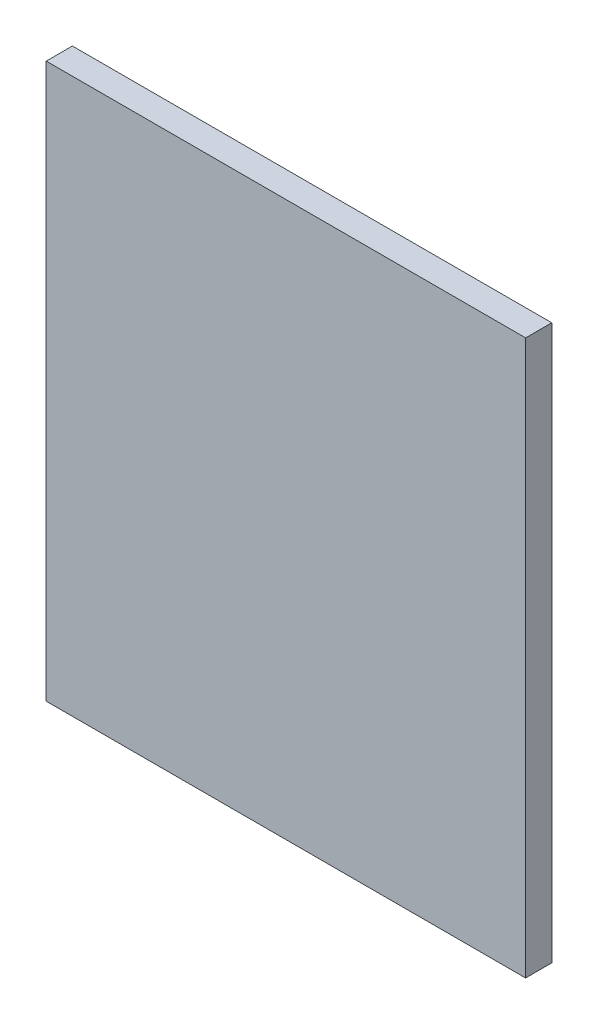
ISO-10303-21;
HEADER;
FILE_DESCRIPTION(('STEP AP214'),'2;1');
FILE_NAME('part.step','',(''),(''),'','','');
FILE_SCHEMA(('AUTOMOTIVE_DESIGN { 1 0 10303 214 1 1 1 1 }'));
ENDSEC;
DATA;
#1=APPLICATION_CONTEXT('core data for automotive mechanical design processes');
#2=APPLICATION_PROTOCOL_DEFINITION('international standard','automotive_design',2000,#1);
#3=PRODUCT_CONTEXT('',#1,'mechanical');
#4=PRODUCT('Part','Part','',(#3));
#5=PRODUCT_RELATED_PRODUCT_CATEGORY('part','',(#4));
#6=PRODUCT_DEFINITION_FORMATION('','',#4);
#7=PRODUCT_DEFINITION_CONTEXT('part definition',#1,'design');
#8=PRODUCT_DEFINITION('design','',#6,#7);
#9=PRODUCT_DEFINITION_SHAPE('','',#8);
#10=(LENGTH_UNIT() NAMED_UNIT(*) SI_UNIT(.MILLI.,.METRE.));
#11=(NAMED_UNIT(*) PLANE_ANGLE_UNIT() SI_UNIT($,.RADIAN.));
#12=(NAMED_UNIT(*) SI_UNIT($,.STERADIAN.) SOLID_ANGLE_UNIT());
#13=UNCERTAINTY_MEASURE_WITH_UNIT(LENGTH_MEASURE(1.E-05),#10,'distance_accuracy_value','');
#14=(GEOMETRIC_REPRESENTATION_CONTEXT(3) GLOBAL_UNCERTAINTY_ASSIGNED_CONTEXT((#13)) GLOBAL_UNIT_ASSIGNED_CONTEXT((#10,
#11,#12)) REPRESENTATION_CONTEXT('',''));
#15=CARTESIAN_POINT('',(0.,0.,0.));
#16=DIRECTION('',(0.,0.,1.));
#17=DIRECTION('',(1.,0.,0.));
#18=AXIS2_PLACEMENT_3D('',#15,#16,#17);
#19=CARTESIAN_POINT('',(0.,0.,15.));
#20=DIRECTION('',(1.,0.,0.));
#21=DIRECTION('',(0.,0.,-1.));
#22=AXIS2_PLACEMENT_3D('',#19,#20,#21);
#23=PLANE('',#22);
#24=DIRECTION('',(0.,-1.,0.));
#25=VECTOR('',#24,1.);
#26=CARTESIAN_POINT('',(0.,0.,0.));
#27=LINE('',#26,#25);
#28=CARTESIAN_POINT('',(0.,318.,0.));
#29=VERTEX_POINT('',#28);
#30=CARTESIAN_POINT('',(0.,0.,0.));
#31=VERTEX_POINT('',#30);
#32=EDGE_CURVE('E95',#29,#31,#27,.T.);
#33=ORIENTED_EDGE('',*,*,#32,.T.);
#34=DIRECTION('',(0.,0.,-1.));
#35=VECTOR('',#34,1.);
#36=CARTESIAN_POINT('',(0.,0.,15.));
#37=LINE('',#36,#35);
#38=CARTESIAN_POINT('',(0.,0.,15.));
#39=VERTEX_POINT('',#38);
#40=EDGE_CURVE('E11',#39,#31,#37,.T.);
#41=ORIENTED_EDGE('',*,*,#40,.F.);
#42=DIRECTION('',(0.,-1.,0.));
#43=VECTOR('',#42,1.);
#44=CARTESIAN_POINT('',(0.,0.,15.));
#45=LINE('',#44,#43);
#46=CARTESIAN_POINT('',(0.,318.,15.));
#47=VERTEX_POINT('',#46);
#48=EDGE_CURVE('E83',#47,#39,#45,.T.);
#49=ORIENTED_EDGE('',*,*,#48,.F.);
#50=DIRECTION('',(0.,0.,-1.));
#51=VECTOR('',#50,1.);
#52=CARTESIAN_POINT('',(0.,318.,15.));
#53=LINE('',#52,#51);
#54=EDGE_CURVE('E91',#47,#29,#53,.T.);
#55=ORIENTED_EDGE('',*,*,#54,.T.);
#56=EDGE_LOOP('',(#33,#41,#49,#55));
#57=FACE_BOUND('',#56,.T.);
#58=ADVANCED_FACE('F32',(#57),#23,.F.);
#59=CARTESIAN_POINT('',(0.,0.,15.));
#60=DIRECTION('',(0.,1.,0.));
#61=DIRECTION('',(0.,0.,1.));
#62=AXIS2_PLACEMENT_3D('',#59,#60,#61);
#63=PLANE('',#62);
#64=DIRECTION('',(1.,0.,0.));
#65=VECTOR('',#64,1.);
#66=CARTESIAN_POINT('',(0.,0.,0.));
#67=LINE('',#66,#65);
#68=CARTESIAN_POINT('',(275.,0.,0.));
#69=VERTEX_POINT('',#68);
#70=EDGE_CURVE('E87',#31,#69,#67,.T.);
#71=ORIENTED_EDGE('',*,*,#70,.T.);
#72=DIRECTION('',(0.,0.,-1.));
#73=VECTOR('',#72,1.);
#74=CARTESIAN_POINT('',(275.,0.,15.));
#75=LINE('',#74,#73);
#76=CARTESIAN_POINT('',(275.,0.,15.));
#77=VERTEX_POINT('',#76);
#78=EDGE_CURVE('E40',#77,#69,#75,.T.);
#79=ORIENTED_EDGE('',*,*,#78,.F.);
#80=DIRECTION('',(1.,0.,0.));
#81=VECTOR('',#80,1.);
#82=CARTESIAN_POINT('',(0.,0.,15.));
#83=LINE('',#82,#81);
#84=EDGE_CURVE('E78',#39,#77,#83,.T.);
#85=ORIENTED_EDGE('',*,*,#84,.F.);
#86=ORIENTED_EDGE('',*,*,#40,.T.);
#87=EDGE_LOOP('',(#71,#79,#85,#86));
#88=FACE_BOUND('',#87,.T.);
#89=ADVANCED_FACE('F86',(#88),#63,.F.);
#90=CARTESIAN_POINT('',(275.,0.,15.));
#91=DIRECTION('',(-1.,0.,0.));
#92=DIRECTION('',(0.,0.,1.));
#93=AXIS2_PLACEMENT_3D('',#90,#91,#92);
#94=PLANE('',#93);
#95=DIRECTION('',(0.,1.,0.));
#96=VECTOR('',#95,1.);
#97=CARTESIAN_POINT('',(275.,0.,0.));
#98=LINE('',#97,#96);
#99=CARTESIAN_POINT('',(275.,318.,0.));
#100=VERTEX_POINT('',#99);
#101=EDGE_CURVE('E65',#69,#100,#98,.T.);
#102=ORIENTED_EDGE('',*,*,#101,.T.);
#103=DIRECTION('',(0.,0.,-1.));
#104=VECTOR('',#103,1.);
#105=CARTESIAN_POINT('',(275.,318.,15.));
#106=LINE('',#105,#104);
#107=CARTESIAN_POINT('',(275.,318.,15.));
#108=VERTEX_POINT('',#107);
#109=EDGE_CURVE('E88',#108,#100,#106,.T.);
#110=ORIENTED_EDGE('',*,*,#109,.F.);
#111=DIRECTION('',(0.,1.,0.));
#112=VECTOR('',#111,1.);
#113=CARTESIAN_POINT('',(275.,0.,15.));
#114=LINE('',#113,#112);
#115=EDGE_CURVE('E81',#77,#108,#114,.T.);
#116=ORIENTED_EDGE('',*,*,#115,.F.);
#117=ORIENTED_EDGE('',*,*,#78,.T.);
#118=EDGE_LOOP('',(#102,#110,#116,#117));
#119=FACE_BOUND('',#118,.T.);
#120=ADVANCED_FACE('F89',(#119),#94,.F.);
#121=CARTESIAN_POINT('',(0.,318.,15.));
#122=DIRECTION('',(0.,-1.,0.));
#123=DIRECTION('',(0.,0.,-1.));
#124=AXIS2_PLACEMENT_3D('',#121,#122,#123);
#125=PLANE('',#124);
#126=DIRECTION('',(-1.,0.,0.));
#127=VECTOR('',#126,1.);
#128=CARTESIAN_POINT('',(0.,318.,0.));
#129=LINE('',#128,#127);
#130=EDGE_CURVE('E71',#100,#29,#129,.T.);
#131=ORIENTED_EDGE('',*,*,#130,.T.);
#132=ORIENTED_EDGE('',*,*,#54,.F.);
#133=DIRECTION('',(-1.,0.,0.));
#134=VECTOR('',#133,1.);
#135=CARTESIAN_POINT('',(0.,318.,15.));
#136=LINE('',#135,#134);
#137=EDGE_CURVE('E48',#108,#47,#136,.T.);
#138=ORIENTED_EDGE('',*,*,#137,.F.);
#139=ORIENTED_EDGE('',*,*,#109,.T.);
#140=EDGE_LOOP('',(#131,#132,#138,#139));
#141=FACE_BOUND('',#140,.T.);
#142=ADVANCED_FACE('F102',(#141),#125,.F.);
#143=CARTESIAN_POINT('',(0.,0.,15.));
#144=DIRECTION('',(0.,0.,-1.));
#145=DIRECTION('',(-1.,0.,0.));
#146=AXIS2_PLACEMENT_3D('',#143,#144,#145);
#147=PLANE('',#146);
#148=ORIENTED_EDGE('',*,*,#48,.T.);
#149=ORIENTED_EDGE('',*,*,#84,.T.);
#150=ORIENTED_EDGE('',*,*,#115,.T.);
#151=ORIENTED_EDGE('',*,*,#137,.T.);
#152=EDGE_LOOP('',(#148,#149,#150,#151));
#153=FACE_BOUND('',#152,.T.);
#154=ADVANCED_FACE('F79',(#153),#147,.F.);
#155=CARTESIAN_POINT('',(0.,0.,0.));
#156=DIRECTION('',(0.,0.,-1.));
#157=DIRECTION('',(-1.,0.,0.));
#158=AXIS2_PLACEMENT_3D('',#155,#156,#157);
#159=PLANE('',#158);
#160=ORIENTED_EDGE('',*,*,#32,.F.);
#161=ORIENTED_EDGE('',*,*,#130,.F.);
#162=ORIENTED_EDGE('',*,*,#101,.F.);
#163=ORIENTED_EDGE('',*,*,#70,.F.);
#164=EDGE_LOOP('',(#160,#161,#162,#163));
#165=FACE_BOUND('',#164,.T.);
#166=ADVANCED_FACE('F105',(#165),#159,.T.);
#167=CLOSED_SHELL('',(#58,#89,#120,#142,#154,#166));
#168=MANIFOLD_SOLID_BREP('B2',#167);
#169=ADVANCED_BREP_SHAPE_REPRESENTATION('',(#18,#168),#14);
#170=SHAPE_DEFINITION_REPRESENTATION(#9,#169);
ENDSEC;
END-ISO-10303-21;
